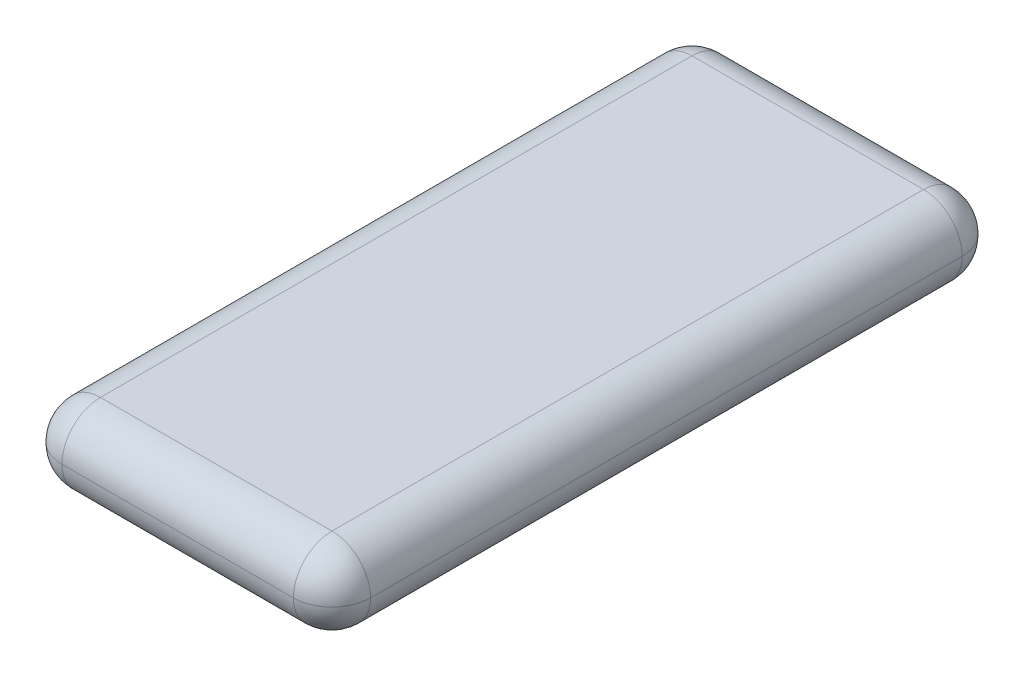
ISO-10303-21;
HEADER;
FILE_DESCRIPTION(('STEP AP214'),'2;1');
FILE_NAME('part.step','',(''),(''),'','','');
FILE_SCHEMA(('AUTOMOTIVE_DESIGN { 1 0 10303 214 1 1 1 1 }'));
ENDSEC;
DATA;
#1=APPLICATION_CONTEXT('core data for automotive mechanical design processes');
#2=APPLICATION_PROTOCOL_DEFINITION('international standard','automotive_design',2000,#1);
#3=PRODUCT_CONTEXT('',#1,'mechanical');
#4=PRODUCT('Part','Part','',(#3));
#5=PRODUCT_RELATED_PRODUCT_CATEGORY('part','',(#4));
#6=PRODUCT_DEFINITION_FORMATION('','',#4);
#7=PRODUCT_DEFINITION_CONTEXT('part definition',#1,'design');
#8=PRODUCT_DEFINITION('design','',#6,#7);
#9=PRODUCT_DEFINITION_SHAPE('','',#8);
#10=(LENGTH_UNIT() NAMED_UNIT(*) SI_UNIT(.MILLI.,.METRE.));
#11=(NAMED_UNIT(*) PLANE_ANGLE_UNIT() SI_UNIT($,.RADIAN.));
#12=(NAMED_UNIT(*) SI_UNIT($,.STERADIAN.) SOLID_ANGLE_UNIT());
#13=UNCERTAINTY_MEASURE_WITH_UNIT(LENGTH_MEASURE(1.E-05),#10,'distance_accuracy_value','');
#14=(GEOMETRIC_REPRESENTATION_CONTEXT(3) GLOBAL_UNCERTAINTY_ASSIGNED_CONTEXT((#13)) GLOBAL_UNIT_ASSIGNED_CONTEXT((#10,
#11,#12)) REPRESENTATION_CONTEXT('',''));
#15=CARTESIAN_POINT('',(0.,0.,0.));
#16=DIRECTION('',(0.,0.,1.));
#17=DIRECTION('',(1.,0.,0.));
#18=AXIS2_PLACEMENT_3D('',#15,#16,#17);
#19=CARTESIAN_POINT('',(0.,3.,0.));
#20=DIRECTION('',(0.,-1.,0.));
#21=DIRECTION('',(0.,0.,-1.));
#22=AXIS2_PLACEMENT_3D('',#19,#20,#21);
#23=PLANE('',#22);
#24=DIRECTION('',(-1.,0.,0.));
#25=VECTOR('',#24,1.);
#26=CARTESIAN_POINT('',(0.,3.,-11.5));
#27=LINE('',#26,#25);
#28=CARTESIAN_POINT('',(4.5,3.,-11.5));
#29=VERTEX_POINT('',#28);
#30=CARTESIAN_POINT('',(-4.5,3.,-11.5));
#31=VERTEX_POINT('',#30);
#32=EDGE_CURVE('E45',#29,#31,#27,.T.);
#33=ORIENTED_EDGE('',*,*,#32,.T.);
#34=DIRECTION('',(0.,0.,1.));
#35=VECTOR('',#34,1.);
#36=CARTESIAN_POINT('',(-4.5,3.,0.));
#37=LINE('',#36,#35);
#38=CARTESIAN_POINT('',(-4.5,3.,11.5));
#39=VERTEX_POINT('',#38);
#40=EDGE_CURVE('E11',#31,#39,#37,.T.);
#41=ORIENTED_EDGE('',*,*,#40,.T.);
#42=DIRECTION('',(1.,0.,0.));
#43=VECTOR('',#42,1.);
#44=CARTESIAN_POINT('',(0.,3.,11.5));
#45=LINE('',#44,#43);
#46=CARTESIAN_POINT('',(4.5,3.,11.5));
#47=VERTEX_POINT('',#46);
#48=EDGE_CURVE('E110',#39,#47,#45,.T.);
#49=ORIENTED_EDGE('',*,*,#48,.T.);
#50=DIRECTION('',(0.,0.,-1.));
#51=VECTOR('',#50,1.);
#52=CARTESIAN_POINT('',(4.5,3.,0.));
#53=LINE('',#52,#51);
#54=EDGE_CURVE('E113',#47,#29,#53,.T.);
#55=ORIENTED_EDGE('',*,*,#54,.T.);
#56=EDGE_LOOP('',(#33,#41,#49,#55));
#57=FACE_BOUND('',#56,.T.);
#58=ADVANCED_FACE('F35',(#57),#23,.F.);
#59=CARTESIAN_POINT('',(0.,0.,0.));
#60=DIRECTION('',(0.,-1.,0.));
#61=DIRECTION('',(0.,0.,-1.));
#62=AXIS2_PLACEMENT_3D('',#59,#60,#61);
#63=PLANE('',#62);
#64=DIRECTION('',(0.,0.,1.));
#65=VECTOR('',#64,1.);
#66=CARTESIAN_POINT('',(-4.5,0.,-13.));
#67=LINE('',#66,#65);
#68=CARTESIAN_POINT('',(-4.5,0.,11.5));
#69=VERTEX_POINT('',#68);
#70=CARTESIAN_POINT('',(-4.5,0.,-11.5));
#71=VERTEX_POINT('',#70);
#72=EDGE_CURVE('E201',#69,#71,#67,.F.);
#73=ORIENTED_EDGE('',*,*,#72,.T.);
#74=DIRECTION('',(-1.,0.,0.));
#75=VECTOR('',#74,1.);
#76=CARTESIAN_POINT('',(6.,0.,-11.5));
#77=LINE('',#76,#75);
#78=CARTESIAN_POINT('',(4.5,0.,-11.5));
#79=VERTEX_POINT('',#78);
#80=EDGE_CURVE('E115',#71,#79,#77,.F.);
#81=ORIENTED_EDGE('',*,*,#80,.T.);
#82=DIRECTION('',(0.,0.,-1.));
#83=VECTOR('',#82,1.);
#84=CARTESIAN_POINT('',(4.5,0.,13.));
#85=LINE('',#84,#83);
#86=CARTESIAN_POINT('',(4.5,0.,11.5));
#87=VERTEX_POINT('',#86);
#88=EDGE_CURVE('E97',#79,#87,#85,.F.);
#89=ORIENTED_EDGE('',*,*,#88,.T.);
#90=DIRECTION('',(1.,0.,0.));
#91=VECTOR('',#90,1.);
#92=CARTESIAN_POINT('',(-6.,0.,11.5));
#93=LINE('',#92,#91);
#94=EDGE_CURVE('E122',#87,#69,#93,.F.);
#95=ORIENTED_EDGE('',*,*,#94,.T.);
#96=EDGE_LOOP('',(#73,#81,#89,#95));
#97=FACE_BOUND('',#96,.T.);
#98=ADVANCED_FACE('F207',(#97),#63,.T.);
#99=CARTESIAN_POINT('',(0.,1.5,11.5));
#100=DIRECTION('',(1.,0.,0.));
#101=DIRECTION('',(0.,0.,-1.));
#102=AXIS2_PLACEMENT_3D('',#99,#100,#101);
#103=CYLINDRICAL_SURFACE('',#102,1.5);
#104=DIRECTION('',(1.,0.,0.));
#105=VECTOR('',#104,1.);
#106=CARTESIAN_POINT('',(-6.,1.5,13.));
#107=LINE('',#106,#105);
#108=CARTESIAN_POINT('',(4.5,1.5,13.));
#109=VERTEX_POINT('',#108);
#110=CARTESIAN_POINT('',(-4.5,1.5,13.));
#111=VERTEX_POINT('',#110);
#112=EDGE_CURVE('E120',#109,#111,#107,.F.);
#113=ORIENTED_EDGE('',*,*,#112,.F.);
#114=CARTESIAN_POINT('',(4.5,1.5,11.5));
#115=DIRECTION('',(1.,0.,0.));
#116=DIRECTION('',(0.,0.,-1.));
#117=AXIS2_PLACEMENT_3D('',#114,#115,#116);
#118=CIRCLE('',#117,1.5);
#119=EDGE_CURVE('E39',#47,#109,#118,.T.);
#120=ORIENTED_EDGE('',*,*,#119,.F.);
#121=ORIENTED_EDGE('',*,*,#48,.F.);
#122=CARTESIAN_POINT('',(-4.5,1.5,11.5));
#123=DIRECTION('',(-1.,0.,0.));
#124=DIRECTION('',(0.,0.,1.));
#125=AXIS2_PLACEMENT_3D('',#122,#123,#124);
#126=CIRCLE('',#125,1.5);
#127=EDGE_CURVE('E81',#111,#39,#126,.T.);
#128=ORIENTED_EDGE('',*,*,#127,.F.);
#129=EDGE_LOOP('',(#113,#120,#121,#128));
#130=FACE_BOUND('',#129,.T.);
#131=ADVANCED_FACE('F37',(#130),#103,.T.);
#132=CARTESIAN_POINT('',(4.5,1.5,11.5));
#133=DIRECTION('',(0.,0.,1.));
#134=DIRECTION('',(1.,0.,0.));
#135=AXIS2_PLACEMENT_3D('',#132,#133,#134);
#136=SPHERICAL_SURFACE('',#135,1.5);
#137=ORIENTED_EDGE('',*,*,#119,.T.);
#138=CARTESIAN_POINT('',(4.5,1.5,11.5));
#139=DIRECTION('',(0.,-1.,0.));
#140=DIRECTION('',(0.,0.,-1.));
#141=AXIS2_PLACEMENT_3D('',#138,#139,#140);
#142=CIRCLE('',#141,1.5);
#143=CARTESIAN_POINT('',(6.,1.5,11.5));
#144=VERTEX_POINT('',#143);
#145=EDGE_CURVE('E88',#144,#109,#142,.T.);
#146=ORIENTED_EDGE('',*,*,#145,.F.);
#147=CARTESIAN_POINT('',(4.5,1.5,11.5));
#148=DIRECTION('',(0.,0.,1.));
#149=DIRECTION('',(1.,0.,0.));
#150=AXIS2_PLACEMENT_3D('',#147,#148,#149);
#151=CIRCLE('',#150,1.5);
#152=EDGE_CURVE('E124',#47,#144,#151,.F.);
#153=ORIENTED_EDGE('',*,*,#152,.F.);
#154=EDGE_LOOP('',(#137,#146,#153));
#155=FACE_BOUND('',#154,.T.);
#156=ADVANCED_FACE('F125',(#155),#136,.T.);
#157=CARTESIAN_POINT('',(-4.5,1.5,11.5));
#158=DIRECTION('',(0.,0.,1.));
#159=DIRECTION('',(1.,0.,0.));
#160=AXIS2_PLACEMENT_3D('',#157,#158,#159);
#161=SPHERICAL_SURFACE('',#160,1.5);
#162=CARTESIAN_POINT('',(-4.5,1.5,11.5));
#163=DIRECTION('',(0.,1.,0.));
#164=DIRECTION('',(0.,0.,1.));
#165=AXIS2_PLACEMENT_3D('',#162,#163,#164);
#166=CIRCLE('',#165,1.5);
#167=CARTESIAN_POINT('',(-6.,1.5,11.5));
#168=VERTEX_POINT('',#167);
#169=EDGE_CURVE('E187',#111,#168,#166,.F.);
#170=ORIENTED_EDGE('',*,*,#169,.F.);
#171=ORIENTED_EDGE('',*,*,#127,.T.);
#172=CARTESIAN_POINT('',(-4.5,1.5,11.5));
#173=DIRECTION('',(0.,0.,1.));
#174=DIRECTION('',(1.,0.,0.));
#175=AXIS2_PLACEMENT_3D('',#172,#173,#174);
#176=CIRCLE('',#175,1.5);
#177=EDGE_CURVE('E127',#168,#39,#176,.F.);
#178=ORIENTED_EDGE('',*,*,#177,.F.);
#179=EDGE_LOOP('',(#170,#171,#178));
#180=FACE_BOUND('',#179,.T.);
#181=ADVANCED_FACE('F190',(#180),#161,.T.);
#182=CARTESIAN_POINT('',(-6.,1.5,11.5));
#183=DIRECTION('',(-1.,0.,0.));
#184=DIRECTION('',(0.,0.,1.));
#185=AXIS2_PLACEMENT_3D('',#182,#183,#184);
#186=CYLINDRICAL_SURFACE('',#185,1.5);
#187=CARTESIAN_POINT('',(4.5,1.5,11.5));
#188=DIRECTION('',(1.,0.,0.));
#189=DIRECTION('',(0.,0.,-1.));
#190=AXIS2_PLACEMENT_3D('',#187,#188,#189);
#191=CIRCLE('',#190,1.5);
#192=EDGE_CURVE('E184',#109,#87,#191,.T.);
#193=ORIENTED_EDGE('',*,*,#192,.F.);
#194=ORIENTED_EDGE('',*,*,#112,.T.);
#195=CARTESIAN_POINT('',(-4.5,1.5,11.5));
#196=DIRECTION('',(-1.,0.,0.));
#197=DIRECTION('',(0.,0.,1.));
#198=AXIS2_PLACEMENT_3D('',#195,#196,#197);
#199=CIRCLE('',#198,1.5);
#200=EDGE_CURVE('E179',#69,#111,#199,.T.);
#201=ORIENTED_EDGE('',*,*,#200,.F.);
#202=ORIENTED_EDGE('',*,*,#94,.F.);
#203=EDGE_LOOP('',(#193,#194,#201,#202));
#204=FACE_BOUND('',#203,.T.);
#205=ADVANCED_FACE('F196',(#204),#186,.T.);
#206=CARTESIAN_POINT('',(4.5,1.5,11.5));
#207=DIRECTION('',(0.,0.,1.));
#208=DIRECTION('',(1.,0.,0.));
#209=AXIS2_PLACEMENT_3D('',#206,#207,#208);
#210=SPHERICAL_SURFACE('',#209,1.5);
#211=ORIENTED_EDGE('',*,*,#145,.T.);
#212=ORIENTED_EDGE('',*,*,#192,.T.);
#213=CARTESIAN_POINT('',(4.5,1.5,11.5));
#214=DIRECTION('',(0.,0.,1.));
#215=DIRECTION('',(1.,0.,0.));
#216=AXIS2_PLACEMENT_3D('',#213,#214,#215);
#217=CIRCLE('',#216,1.5);
#218=EDGE_CURVE('E176',#144,#87,#217,.F.);
#219=ORIENTED_EDGE('',*,*,#218,.F.);
#220=EDGE_LOOP('',(#211,#212,#219));
#221=FACE_BOUND('',#220,.T.);
#222=ADVANCED_FACE('F208',(#221),#210,.T.);
#223=CARTESIAN_POINT('',(4.5,1.5,0.));
#224=DIRECTION('',(0.,0.,-1.));
#225=DIRECTION('',(-1.,0.,0.));
#226=AXIS2_PLACEMENT_3D('',#223,#224,#225);
#227=CYLINDRICAL_SURFACE('',#226,1.5);
#228=ORIENTED_EDGE('',*,*,#54,.F.);
#229=ORIENTED_EDGE('',*,*,#152,.T.);
#230=DIRECTION('',(0.,0.,-1.));
#231=VECTOR('',#230,1.);
#232=CARTESIAN_POINT('',(6.,1.5,13.));
#233=LINE('',#232,#231);
#234=CARTESIAN_POINT('',(6.,1.5,-11.5));
#235=VERTEX_POINT('',#234);
#236=EDGE_CURVE('E173',#235,#144,#233,.F.);
#237=ORIENTED_EDGE('',*,*,#236,.F.);
#238=CARTESIAN_POINT('',(4.5,1.5,-11.5));
#239=DIRECTION('',(0.,0.,-1.));
#240=DIRECTION('',(-1.,0.,0.));
#241=AXIS2_PLACEMENT_3D('',#238,#239,#240);
#242=CIRCLE('',#241,1.5);
#243=EDGE_CURVE('E131',#29,#235,#242,.T.);
#244=ORIENTED_EDGE('',*,*,#243,.F.);
#245=EDGE_LOOP('',(#228,#229,#237,#244));
#246=FACE_BOUND('',#245,.T.);
#247=ADVANCED_FACE('F129',(#246),#227,.T.);
#248=CARTESIAN_POINT('',(-4.5,1.5,0.));
#249=DIRECTION('',(0.,0.,1.));
#250=DIRECTION('',(1.,0.,0.));
#251=AXIS2_PLACEMENT_3D('',#248,#249,#250);
#252=CYLINDRICAL_SURFACE('',#251,1.5);
#253=ORIENTED_EDGE('',*,*,#177,.T.);
#254=ORIENTED_EDGE('',*,*,#40,.F.);
#255=CARTESIAN_POINT('',(-4.5,1.5,-11.5));
#256=DIRECTION('',(0.,0.,-1.));
#257=DIRECTION('',(0.,1.,0.));
#258=AXIS2_PLACEMENT_3D('',#255,#256,#257);
#259=CIRCLE('',#258,1.5);
#260=CARTESIAN_POINT('',(-6.,1.5,-11.5));
#261=VERTEX_POINT('',#260);
#262=EDGE_CURVE('E169',#261,#31,#259,.T.);
#263=ORIENTED_EDGE('',*,*,#262,.F.);
#264=DIRECTION('',(0.,0.,1.));
#265=VECTOR('',#264,1.);
#266=CARTESIAN_POINT('',(-6.,1.5,13.));
#267=LINE('',#266,#265);
#268=EDGE_CURVE('E163',#168,#261,#267,.F.);
#269=ORIENTED_EDGE('',*,*,#268,.F.);
#270=EDGE_LOOP('',(#253,#254,#263,#269));
#271=FACE_BOUND('',#270,.T.);
#272=ADVANCED_FACE('F257',(#271),#252,.T.);
#273=CARTESIAN_POINT('',(-4.5,1.5,11.5));
#274=DIRECTION('',(0.,0.,1.));
#275=DIRECTION('',(1.,0.,0.));
#276=AXIS2_PLACEMENT_3D('',#273,#274,#275);
#277=SPHERICAL_SURFACE('',#276,1.5);
#278=ORIENTED_EDGE('',*,*,#200,.T.);
#279=ORIENTED_EDGE('',*,*,#169,.T.);
#280=CARTESIAN_POINT('',(-4.5,1.5,11.5));
#281=DIRECTION('',(0.,0.,1.));
#282=DIRECTION('',(1.,0.,0.));
#283=AXIS2_PLACEMENT_3D('',#280,#281,#282);
#284=CIRCLE('',#283,1.5);
#285=EDGE_CURVE('E160',#69,#168,#284,.F.);
#286=ORIENTED_EDGE('',*,*,#285,.F.);
#287=EDGE_LOOP('',(#278,#279,#286));
#288=FACE_BOUND('',#287,.T.);
#289=ADVANCED_FACE('F197',(#288),#277,.T.);
#290=CARTESIAN_POINT('',(4.5,1.5,13.));
#291=DIRECTION('',(0.,0.,1.));
#292=DIRECTION('',(1.,0.,0.));
#293=AXIS2_PLACEMENT_3D('',#290,#291,#292);
#294=CYLINDRICAL_SURFACE('',#293,1.5);
#295=CARTESIAN_POINT('',(4.5,1.5,-11.5));
#296=DIRECTION('',(0.,0.,-1.));
#297=DIRECTION('',(-1.,0.,0.));
#298=AXIS2_PLACEMENT_3D('',#295,#296,#297);
#299=CIRCLE('',#298,1.5);
#300=EDGE_CURVE('E157',#235,#79,#299,.T.);
#301=ORIENTED_EDGE('',*,*,#300,.F.);
#302=ORIENTED_EDGE('',*,*,#236,.T.);
#303=ORIENTED_EDGE('',*,*,#218,.T.);
#304=ORIENTED_EDGE('',*,*,#88,.F.);
#305=EDGE_LOOP('',(#301,#302,#303,#304));
#306=FACE_BOUND('',#305,.T.);
#307=ADVANCED_FACE('F211',(#306),#294,.T.);
#308=CARTESIAN_POINT('',(4.5,1.5,-11.5));
#309=DIRECTION('',(1.,0.,0.));
#310=DIRECTION('',(0.,0.,-1.));
#311=AXIS2_PLACEMENT_3D('',#308,#309,#310);
#312=SPHERICAL_SURFACE('',#311,1.5);
#313=ORIENTED_EDGE('',*,*,#243,.T.);
#314=CARTESIAN_POINT('',(4.5,1.5,-11.5));
#315=DIRECTION('',(0.,-1.,0.));
#316=DIRECTION('',(0.,0.,-1.));
#317=AXIS2_PLACEMENT_3D('',#314,#315,#316);
#318=CIRCLE('',#317,1.5);
#319=CARTESIAN_POINT('',(4.5,1.5,-13.));
#320=VERTEX_POINT('',#319);
#321=EDGE_CURVE('E154',#320,#235,#318,.T.);
#322=ORIENTED_EDGE('',*,*,#321,.F.);
#323=CARTESIAN_POINT('',(4.5,1.5,-11.5));
#324=DIRECTION('',(1.,0.,0.));
#325=DIRECTION('',(0.,0.,-1.));
#326=AXIS2_PLACEMENT_3D('',#323,#324,#325);
#327=CIRCLE('',#326,1.5);
#328=EDGE_CURVE('E151',#29,#320,#327,.F.);
#329=ORIENTED_EDGE('',*,*,#328,.F.);
#330=EDGE_LOOP('',(#313,#322,#329));
#331=FACE_BOUND('',#330,.T.);
#332=ADVANCED_FACE('F216',(#331),#312,.T.);
#333=CARTESIAN_POINT('',(-4.5,1.5,-11.5));
#334=DIRECTION('',(-1.,0.,0.));
#335=DIRECTION('',(0.,0.,1.));
#336=AXIS2_PLACEMENT_3D('',#333,#334,#335);
#337=SPHERICAL_SURFACE('',#336,1.5);
#338=CARTESIAN_POINT('',(-4.5,1.5,-11.5));
#339=DIRECTION('',(0.,1.,0.));
#340=DIRECTION('',(0.,0.,1.));
#341=AXIS2_PLACEMENT_3D('',#338,#339,#340);
#342=CIRCLE('',#341,1.5);
#343=CARTESIAN_POINT('',(-4.5,1.5,-13.));
#344=VERTEX_POINT('',#343);
#345=EDGE_CURVE('E166',#261,#344,#342,.F.);
#346=ORIENTED_EDGE('',*,*,#345,.F.);
#347=ORIENTED_EDGE('',*,*,#262,.T.);
#348=CARTESIAN_POINT('',(-4.5,1.5,-11.5));
#349=DIRECTION('',(-1.,0.,0.));
#350=DIRECTION('',(0.,0.,1.));
#351=AXIS2_PLACEMENT_3D('',#348,#349,#350);
#352=CIRCLE('',#351,1.5);
#353=EDGE_CURVE('E148',#344,#31,#352,.F.);
#354=ORIENTED_EDGE('',*,*,#353,.F.);
#355=EDGE_LOOP('',(#346,#347,#354));
#356=FACE_BOUND('',#355,.T.);
#357=ADVANCED_FACE('F222',(#356),#337,.T.);
#358=CARTESIAN_POINT('',(-4.5,1.5,13.));
#359=DIRECTION('',(0.,0.,-1.));
#360=DIRECTION('',(-1.,0.,0.));
#361=AXIS2_PLACEMENT_3D('',#358,#359,#360);
#362=CYLINDRICAL_SURFACE('',#361,1.5);
#363=ORIENTED_EDGE('',*,*,#285,.T.);
#364=ORIENTED_EDGE('',*,*,#268,.T.);
#365=CARTESIAN_POINT('',(-4.5,1.5,-11.5));
#366=DIRECTION('',(0.,0.,-1.));
#367=DIRECTION('',(-1.,0.,0.));
#368=AXIS2_PLACEMENT_3D('',#365,#366,#367);
#369=CIRCLE('',#368,1.5);
#370=EDGE_CURVE('E145',#71,#261,#369,.T.);
#371=ORIENTED_EDGE('',*,*,#370,.F.);
#372=ORIENTED_EDGE('',*,*,#72,.F.);
#373=EDGE_LOOP('',(#363,#364,#371,#372));
#374=FACE_BOUND('',#373,.T.);
#375=ADVANCED_FACE('F202',(#374),#362,.T.);
#376=CARTESIAN_POINT('',(4.5,1.5,-11.5));
#377=DIRECTION('',(1.,0.,0.));
#378=DIRECTION('',(0.,0.,-1.));
#379=AXIS2_PLACEMENT_3D('',#376,#377,#378);
#380=SPHERICAL_SURFACE('',#379,1.5);
#381=ORIENTED_EDGE('',*,*,#321,.T.);
#382=ORIENTED_EDGE('',*,*,#300,.T.);
#383=CARTESIAN_POINT('',(4.5,1.5,-11.5));
#384=DIRECTION('',(1.,0.,0.));
#385=DIRECTION('',(0.,0.,-1.));
#386=AXIS2_PLACEMENT_3D('',#383,#384,#385);
#387=CIRCLE('',#386,1.5);
#388=EDGE_CURVE('E143',#320,#79,#387,.F.);
#389=ORIENTED_EDGE('',*,*,#388,.F.);
#390=EDGE_LOOP('',(#381,#382,#389));
#391=FACE_BOUND('',#390,.T.);
#392=ADVANCED_FACE('F214',(#391),#380,.T.);
#393=CARTESIAN_POINT('',(0.,1.5,-11.5));
#394=DIRECTION('',(-1.,0.,0.));
#395=DIRECTION('',(0.,0.,1.));
#396=AXIS2_PLACEMENT_3D('',#393,#394,#395);
#397=CYLINDRICAL_SURFACE('',#396,1.5);
#398=ORIENTED_EDGE('',*,*,#32,.F.);
#399=ORIENTED_EDGE('',*,*,#328,.T.);
#400=DIRECTION('',(-1.,0.,0.));
#401=VECTOR('',#400,1.);
#402=CARTESIAN_POINT('',(-6.,1.5,-13.));
#403=LINE('',#402,#401);
#404=EDGE_CURVE('E140',#344,#320,#403,.F.);
#405=ORIENTED_EDGE('',*,*,#404,.F.);
#406=ORIENTED_EDGE('',*,*,#353,.T.);
#407=EDGE_LOOP('',(#398,#399,#405,#406));
#408=FACE_BOUND('',#407,.T.);
#409=ADVANCED_FACE('F219',(#408),#397,.T.);
#410=CARTESIAN_POINT('',(-4.5,1.5,-11.5));
#411=DIRECTION('',(-1.,0.,0.));
#412=DIRECTION('',(0.,0.,1.));
#413=AXIS2_PLACEMENT_3D('',#410,#411,#412);
#414=SPHERICAL_SURFACE('',#413,1.5);
#415=ORIENTED_EDGE('',*,*,#370,.T.);
#416=ORIENTED_EDGE('',*,*,#345,.T.);
#417=CARTESIAN_POINT('',(-4.5,1.5,-11.5));
#418=DIRECTION('',(-1.,0.,0.));
#419=DIRECTION('',(0.,0.,1.));
#420=AXIS2_PLACEMENT_3D('',#417,#418,#419);
#421=CIRCLE('',#420,1.5);
#422=EDGE_CURVE('E137',#71,#344,#421,.F.);
#423=ORIENTED_EDGE('',*,*,#422,.F.);
#424=EDGE_LOOP('',(#415,#416,#423));
#425=FACE_BOUND('',#424,.T.);
#426=ADVANCED_FACE('F225',(#425),#414,.T.);
#427=CARTESIAN_POINT('',(-6.,1.5,-11.5));
#428=DIRECTION('',(1.,0.,0.));
#429=DIRECTION('',(0.,0.,-1.));
#430=AXIS2_PLACEMENT_3D('',#427,#428,#429);
#431=CYLINDRICAL_SURFACE('',#430,1.5);
#432=ORIENTED_EDGE('',*,*,#388,.T.);
#433=ORIENTED_EDGE('',*,*,#80,.F.);
#434=ORIENTED_EDGE('',*,*,#422,.T.);
#435=ORIENTED_EDGE('',*,*,#404,.T.);
#436=EDGE_LOOP('',(#432,#433,#434,#435));
#437=FACE_BOUND('',#436,.T.);
#438=ADVANCED_FACE('F227',(#437),#431,.T.);
#439=CLOSED_SHELL('',(#58,#98,#131,#156,#181,#205,#222,#247,#272,#289,#307,#332,#357,#375,#392,
#409,#426,#438));
#440=MANIFOLD_SOLID_BREP('B2',#439);
#441=ADVANCED_BREP_SHAPE_REPRESENTATION('',(#18,#440),#14);
#442=SHAPE_DEFINITION_REPRESENTATION(#9,#441);
ENDSEC;
END-ISO-10303-21;
